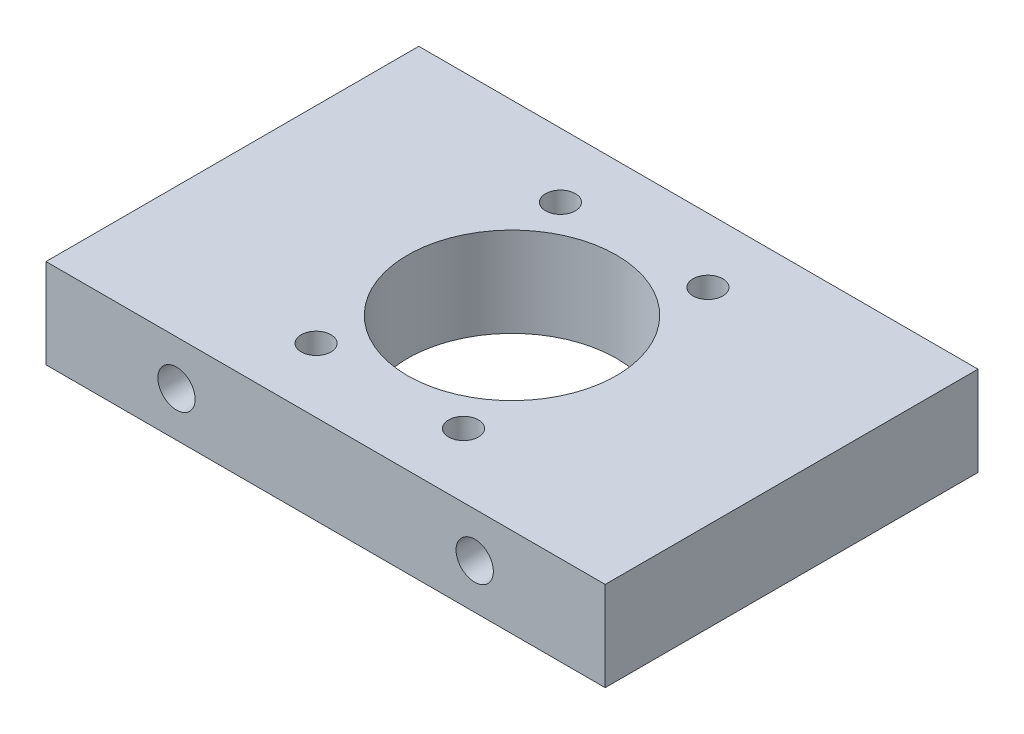
ISO-10303-21;
HEADER;
FILE_DESCRIPTION(('STEP AP214'),'2;1');
FILE_NAME('part.step','',(''),(''),'','','');
FILE_SCHEMA(('AUTOMOTIVE_DESIGN { 1 0 10303 214 1 1 1 1 }'));
ENDSEC;
DATA;
#1=APPLICATION_CONTEXT('core data for automotive mechanical design processes');
#2=APPLICATION_PROTOCOL_DEFINITION('international standard','automotive_design',2000,#1);
#3=PRODUCT_CONTEXT('',#1,'mechanical');
#4=PRODUCT('Part','Part','',(#3));
#5=PRODUCT_RELATED_PRODUCT_CATEGORY('part','',(#4));
#6=PRODUCT_DEFINITION_FORMATION('','',#4);
#7=PRODUCT_DEFINITION_CONTEXT('part definition',#1,'design');
#8=PRODUCT_DEFINITION('design','',#6,#7);
#9=PRODUCT_DEFINITION_SHAPE('','',#8);
#10=(LENGTH_UNIT() NAMED_UNIT(*) SI_UNIT(.MILLI.,.METRE.));
#11=(NAMED_UNIT(*) PLANE_ANGLE_UNIT() SI_UNIT($,.RADIAN.));
#12=(NAMED_UNIT(*) SI_UNIT($,.STERADIAN.) SOLID_ANGLE_UNIT());
#13=UNCERTAINTY_MEASURE_WITH_UNIT(LENGTH_MEASURE(1.E-05),#10,'distance_accuracy_value','');
#14=(GEOMETRIC_REPRESENTATION_CONTEXT(3) GLOBAL_UNCERTAINTY_ASSIGNED_CONTEXT((#13)) GLOBAL_UNIT_ASSIGNED_CONTEXT((#10,
#11,#12)) REPRESENTATION_CONTEXT('',''));
#15=CARTESIAN_POINT('',(0.,0.,0.));
#16=DIRECTION('',(0.,0.,1.));
#17=DIRECTION('',(1.,0.,0.));
#18=AXIS2_PLACEMENT_3D('',#15,#16,#17);
#19=CARTESIAN_POINT('',(37.5,12.,-25.));
#20=DIRECTION('',(0.,0.,1.));
#21=DIRECTION('',(1.,0.,0.));
#22=AXIS2_PLACEMENT_3D('',#19,#20,#21);
#23=PLANE('',#22);
#24=CARTESIAN_POINT('',(-20.0000000000006,6.00000000000134,-25.));
#25=DIRECTION('',(0.,0.,-1.));
#26=DIRECTION('',(-1.,0.,0.));
#27=AXIS2_PLACEMENT_3D('',#24,#25,#26);
#28=CIRCLE('',#27,2.49999999999999);
#29=CARTESIAN_POINT('',(-22.5000000000005,6.00000000000134,-25.));
#30=VERTEX_POINT('',#29);
#31=EDGE_CURVE('E150',#30,#30,#28,.T.);
#32=ORIENTED_EDGE('',*,*,#31,.F.);
#33=EDGE_LOOP('',(#32));
#34=FACE_BOUND('',#33,.T.);
#35=DIRECTION('',(-1.,0.,0.));
#36=VECTOR('',#35,1.);
#37=CARTESIAN_POINT('',(37.5,0.,-25.));
#38=LINE('',#37,#36);
#39=CARTESIAN_POINT('',(37.5,0.,-25.));
#40=VERTEX_POINT('',#39);
#41=CARTESIAN_POINT('',(-37.5,0.,-25.));
#42=VERTEX_POINT('',#41);
#43=EDGE_CURVE('E74',#40,#42,#38,.T.);
#44=ORIENTED_EDGE('',*,*,#43,.T.);
#45=DIRECTION('',(0.,-1.,0.));
#46=VECTOR('',#45,1.);
#47=CARTESIAN_POINT('',(-37.5,12.,-25.));
#48=LINE('',#47,#46);
#49=CARTESIAN_POINT('',(-37.5,12.,-25.));
#50=VERTEX_POINT('',#49);
#51=EDGE_CURVE('E94',#50,#42,#48,.T.);
#52=ORIENTED_EDGE('',*,*,#51,.F.);
#53=DIRECTION('',(-1.,0.,0.));
#54=VECTOR('',#53,1.);
#55=CARTESIAN_POINT('',(37.5,12.,-25.));
#56=LINE('',#55,#54);
#57=CARTESIAN_POINT('',(37.5,12.,-25.));
#58=VERTEX_POINT('',#57);
#59=EDGE_CURVE('E51',#58,#50,#56,.T.);
#60=ORIENTED_EDGE('',*,*,#59,.F.);
#61=DIRECTION('',(0.,-1.,0.));
#62=VECTOR('',#61,1.);
#63=CARTESIAN_POINT('',(37.5,12.,-25.));
#64=LINE('',#63,#62);
#65=EDGE_CURVE('E91',#58,#40,#64,.T.);
#66=ORIENTED_EDGE('',*,*,#65,.T.);
#67=EDGE_LOOP('',(#44,#52,#60,#66));
#68=FACE_BOUND('',#67,.T.);
#69=CARTESIAN_POINT('',(20.0000000000006,6.00000000000134,-25.));
#70=DIRECTION('',(0.,0.,-1.));
#71=DIRECTION('',(-1.,0.,0.));
#72=AXIS2_PLACEMENT_3D('',#69,#70,#71);
#73=CIRCLE('',#72,2.49999999999999);
#74=CARTESIAN_POINT('',(17.5000000000006,6.00000000000134,-25.));
#75=VERTEX_POINT('',#74);
#76=EDGE_CURVE('E144',#75,#75,#73,.T.);
#77=ORIENTED_EDGE('',*,*,#76,.F.);
#78=EDGE_LOOP('',(#77));
#79=FACE_BOUND('',#78,.T.);
#80=ADVANCED_FACE('F34',(#34,#68,#79),#23,.F.);
#81=CARTESIAN_POINT('',(-37.5,12.,25.));
#82=DIRECTION('',(1.,0.,0.));
#83=DIRECTION('',(0.,0.,-1.));
#84=AXIS2_PLACEMENT_3D('',#81,#82,#83);
#85=PLANE('',#84);
#86=DIRECTION('',(0.,0.,1.));
#87=VECTOR('',#86,1.);
#88=CARTESIAN_POINT('',(-37.5,0.,25.));
#89=LINE('',#88,#87);
#90=CARTESIAN_POINT('',(-37.5,0.,25.));
#91=VERTEX_POINT('',#90);
#92=EDGE_CURVE('E98',#42,#91,#89,.T.);
#93=ORIENTED_EDGE('',*,*,#92,.T.);
#94=DIRECTION('',(0.,-1.,0.));
#95=VECTOR('',#94,1.);
#96=CARTESIAN_POINT('',(-37.5,12.,25.));
#97=LINE('',#96,#95);
#98=CARTESIAN_POINT('',(-37.5,12.,25.));
#99=VERTEX_POINT('',#98);
#100=EDGE_CURVE('E11',#99,#91,#97,.T.);
#101=ORIENTED_EDGE('',*,*,#100,.F.);
#102=DIRECTION('',(0.,0.,1.));
#103=VECTOR('',#102,1.);
#104=CARTESIAN_POINT('',(-37.5,12.,25.));
#105=LINE('',#104,#103);
#106=EDGE_CURVE('E86',#50,#99,#105,.T.);
#107=ORIENTED_EDGE('',*,*,#106,.F.);
#108=ORIENTED_EDGE('',*,*,#51,.T.);
#109=EDGE_LOOP('',(#93,#101,#107,#108));
#110=FACE_BOUND('',#109,.T.);
#111=ADVANCED_FACE('F36',(#110),#85,.F.);
#112=CARTESIAN_POINT('',(37.5,12.,25.));
#113=DIRECTION('',(0.,0.,-1.));
#114=DIRECTION('',(-1.,0.,0.));
#115=AXIS2_PLACEMENT_3D('',#112,#113,#114);
#116=PLANE('',#115);
#117=CARTESIAN_POINT('',(-20.0000000000006,6.00000000000134,25.));
#118=DIRECTION('',(0.,0.,-1.));
#119=DIRECTION('',(-1.,0.,0.));
#120=AXIS2_PLACEMENT_3D('',#117,#118,#119);
#121=CIRCLE('',#120,2.49999999999998);
#122=CARTESIAN_POINT('',(-22.5000000000005,6.00000000000134,25.));
#123=VERTEX_POINT('',#122);
#124=EDGE_CURVE('E147',#123,#123,#121,.T.);
#125=ORIENTED_EDGE('',*,*,#124,.T.);
#126=EDGE_LOOP('',(#125));
#127=FACE_BOUND('',#126,.T.);
#128=CARTESIAN_POINT('',(20.0000000000006,6.00000000000134,25.));
#129=DIRECTION('',(0.,0.,-1.));
#130=DIRECTION('',(-1.,0.,0.));
#131=AXIS2_PLACEMENT_3D('',#128,#129,#130);
#132=CIRCLE('',#131,2.49999999999998);
#133=CARTESIAN_POINT('',(17.5000000000006,6.00000000000134,25.));
#134=VERTEX_POINT('',#133);
#135=EDGE_CURVE('E141',#134,#134,#132,.T.);
#136=ORIENTED_EDGE('',*,*,#135,.T.);
#137=EDGE_LOOP('',(#136));
#138=FACE_BOUND('',#137,.T.);
#139=DIRECTION('',(1.,0.,0.));
#140=VECTOR('',#139,1.);
#141=CARTESIAN_POINT('',(37.5,0.,25.));
#142=LINE('',#141,#140);
#143=CARTESIAN_POINT('',(37.5,0.,25.));
#144=VERTEX_POINT('',#143);
#145=EDGE_CURVE('E90',#91,#144,#142,.T.);
#146=ORIENTED_EDGE('',*,*,#145,.T.);
#147=DIRECTION('',(0.,-1.,0.));
#148=VECTOR('',#147,1.);
#149=CARTESIAN_POINT('',(37.5,12.,25.));
#150=LINE('',#149,#148);
#151=CARTESIAN_POINT('',(37.5,12.,25.));
#152=VERTEX_POINT('',#151);
#153=EDGE_CURVE('E43',#152,#144,#150,.T.);
#154=ORIENTED_EDGE('',*,*,#153,.F.);
#155=DIRECTION('',(1.,0.,0.));
#156=VECTOR('',#155,1.);
#157=CARTESIAN_POINT('',(37.5,12.,25.));
#158=LINE('',#157,#156);
#159=EDGE_CURVE('E81',#99,#152,#158,.T.);
#160=ORIENTED_EDGE('',*,*,#159,.F.);
#161=ORIENTED_EDGE('',*,*,#100,.T.);
#162=EDGE_LOOP('',(#146,#154,#160,#161));
#163=FACE_BOUND('',#162,.T.);
#164=ADVANCED_FACE('F89',(#127,#138,#163),#116,.F.);
#165=CARTESIAN_POINT('',(37.5,12.,25.));
#166=DIRECTION('',(-1.,0.,0.));
#167=DIRECTION('',(0.,0.,1.));
#168=AXIS2_PLACEMENT_3D('',#165,#166,#167);
#169=PLANE('',#168);
#170=DIRECTION('',(0.,0.,-1.));
#171=VECTOR('',#170,1.);
#172=CARTESIAN_POINT('',(37.5,0.,25.));
#173=LINE('',#172,#171);
#174=EDGE_CURVE('E68',#144,#40,#173,.T.);
#175=ORIENTED_EDGE('',*,*,#174,.T.);
#176=ORIENTED_EDGE('',*,*,#65,.F.);
#177=DIRECTION('',(0.,0.,-1.));
#178=VECTOR('',#177,1.);
#179=CARTESIAN_POINT('',(37.5,12.,25.));
#180=LINE('',#179,#178);
#181=EDGE_CURVE('E84',#152,#58,#180,.T.);
#182=ORIENTED_EDGE('',*,*,#181,.F.);
#183=ORIENTED_EDGE('',*,*,#153,.T.);
#184=EDGE_LOOP('',(#175,#176,#182,#183));
#185=FACE_BOUND('',#184,.T.);
#186=ADVANCED_FACE('F92',(#185),#169,.F.);
#187=CARTESIAN_POINT('',(0.,12.,0.));
#188=DIRECTION('',(0.,1.,0.));
#189=DIRECTION('',(0.,0.,1.));
#190=AXIS2_PLACEMENT_3D('',#187,#188,#189);
#191=PLANE('',#190);
#192=CARTESIAN_POINT('',(9.88696854870743,12.,-16.3888228623751));
#193=DIRECTION('',(0.,1.,0.));
#194=DIRECTION('',(0.,0.,1.));
#195=AXIS2_PLACEMENT_3D('',#192,#193,#194);
#196=CIRCLE('',#195,2.);
#197=CARTESIAN_POINT('',(9.88696854870743,12.,-14.3888228623751));
#198=VERTEX_POINT('',#197);
#199=EDGE_CURVE('E135',#198,#198,#196,.T.);
#200=ORIENTED_EDGE('',*,*,#199,.F.);
#201=EDGE_LOOP('',(#200));
#202=FACE_BOUND('',#201,.T.);
#203=CARTESIAN_POINT('',(-9.88696854870743,12.,-16.3888228623751));
#204=DIRECTION('',(0.,1.,0.));
#205=DIRECTION('',(0.,0.,1.));
#206=AXIS2_PLACEMENT_3D('',#203,#204,#205);
#207=CIRCLE('',#206,2.);
#208=CARTESIAN_POINT('',(-9.88696854870743,12.,-14.3888228623751));
#209=VERTEX_POINT('',#208);
#210=EDGE_CURVE('E129',#209,#209,#207,.T.);
#211=ORIENTED_EDGE('',*,*,#210,.F.);
#212=EDGE_LOOP('',(#211));
#213=FACE_BOUND('',#212,.T.);
#214=CARTESIAN_POINT('',(9.88696854870743,12.,16.3888228623751));
#215=DIRECTION('',(0.,1.,0.));
#216=DIRECTION('',(0.,0.,1.));
#217=AXIS2_PLACEMENT_3D('',#214,#215,#216);
#218=CIRCLE('',#217,2.);
#219=CARTESIAN_POINT('',(9.88696854870743,12.,18.3888228623751));
#220=VERTEX_POINT('',#219);
#221=EDGE_CURVE('E123',#220,#220,#218,.T.);
#222=ORIENTED_EDGE('',*,*,#221,.F.);
#223=EDGE_LOOP('',(#222));
#224=FACE_BOUND('',#223,.T.);
#225=CARTESIAN_POINT('',(-9.88696854870743,12.,16.3888228623751));
#226=DIRECTION('',(0.,1.,0.));
#227=DIRECTION('',(0.,0.,1.));
#228=AXIS2_PLACEMENT_3D('',#225,#226,#227);
#229=CIRCLE('',#228,2.);
#230=CARTESIAN_POINT('',(-9.88696854870743,12.,18.3888228623751));
#231=VERTEX_POINT('',#230);
#232=EDGE_CURVE('E115',#231,#231,#229,.T.);
#233=ORIENTED_EDGE('',*,*,#232,.F.);
#234=EDGE_LOOP('',(#233));
#235=FACE_BOUND('',#234,.T.);
#236=CARTESIAN_POINT('',(0.,12.,0.));
#237=DIRECTION('',(0.,1.,0.));
#238=DIRECTION('',(0.,0.,1.));
#239=AXIS2_PLACEMENT_3D('',#236,#237,#238);
#240=CIRCLE('',#239,14.01);
#241=CARTESIAN_POINT('',(0.,12.,14.01));
#242=VERTEX_POINT('',#241);
#243=EDGE_CURVE('E112',#242,#242,#240,.T.);
#244=ORIENTED_EDGE('',*,*,#243,.F.);
#245=EDGE_LOOP('',(#244));
#246=FACE_BOUND('',#245,.T.);
#247=ORIENTED_EDGE('',*,*,#106,.T.);
#248=ORIENTED_EDGE('',*,*,#159,.T.);
#249=ORIENTED_EDGE('',*,*,#181,.T.);
#250=ORIENTED_EDGE('',*,*,#59,.T.);
#251=EDGE_LOOP('',(#247,#248,#249,#250));
#252=FACE_BOUND('',#251,.T.);
#253=ADVANCED_FACE('F82',(#202,#213,#224,#235,#246,#252),#191,.T.);
#254=CARTESIAN_POINT('',(0.,0.,0.));
#255=DIRECTION('',(0.,1.,0.));
#256=DIRECTION('',(0.,0.,1.));
#257=AXIS2_PLACEMENT_3D('',#254,#255,#256);
#258=PLANE('',#257);
#259=CARTESIAN_POINT('',(9.88696854870743,0.,-16.3888228623751));
#260=DIRECTION('',(0.,-1.,0.));
#261=DIRECTION('',(0.,0.,-1.));
#262=AXIS2_PLACEMENT_3D('',#259,#260,#261);
#263=CIRCLE('',#262,2.);
#264=CARTESIAN_POINT('',(9.88696854870743,0.,-18.3888228623751));
#265=VERTEX_POINT('',#264);
#266=EDGE_CURVE('E138',#265,#265,#263,.T.);
#267=ORIENTED_EDGE('',*,*,#266,.F.);
#268=EDGE_LOOP('',(#267));
#269=FACE_BOUND('',#268,.T.);
#270=CARTESIAN_POINT('',(-9.88696854870743,0.,-16.3888228623751));
#271=DIRECTION('',(0.,-1.,0.));
#272=DIRECTION('',(0.,0.,1.));
#273=AXIS2_PLACEMENT_3D('',#270,#271,#272);
#274=CIRCLE('',#273,2.);
#275=CARTESIAN_POINT('',(-9.88696854870743,0.,-14.3888228623751));
#276=VERTEX_POINT('',#275);
#277=EDGE_CURVE('E132',#276,#276,#274,.T.);
#278=ORIENTED_EDGE('',*,*,#277,.F.);
#279=EDGE_LOOP('',(#278));
#280=FACE_BOUND('',#279,.T.);
#281=CARTESIAN_POINT('',(9.88696854870743,0.,16.3888228623751));
#282=DIRECTION('',(0.,-1.,0.));
#283=DIRECTION('',(0.,0.,1.));
#284=AXIS2_PLACEMENT_3D('',#281,#282,#283);
#285=CIRCLE('',#284,2.);
#286=CARTESIAN_POINT('',(9.88696854870743,0.,18.3888228623751));
#287=VERTEX_POINT('',#286);
#288=EDGE_CURVE('E126',#287,#287,#285,.T.);
#289=ORIENTED_EDGE('',*,*,#288,.F.);
#290=EDGE_LOOP('',(#289));
#291=FACE_BOUND('',#290,.T.);
#292=CARTESIAN_POINT('',(-9.88696854870743,0.,16.3888228623751));
#293=DIRECTION('',(0.,-1.,0.));
#294=DIRECTION('',(0.,0.,-1.));
#295=AXIS2_PLACEMENT_3D('',#292,#293,#294);
#296=CIRCLE('',#295,2.);
#297=CARTESIAN_POINT('',(-9.88696854870743,0.,14.3888228623751));
#298=VERTEX_POINT('',#297);
#299=EDGE_CURVE('E120',#298,#298,#296,.T.);
#300=ORIENTED_EDGE('',*,*,#299,.F.);
#301=EDGE_LOOP('',(#300));
#302=FACE_BOUND('',#301,.T.);
#303=CARTESIAN_POINT('',(0.,0.,0.));
#304=DIRECTION('',(0.,1.,0.));
#305=DIRECTION('',(0.,0.,1.));
#306=AXIS2_PLACEMENT_3D('',#303,#304,#305);
#307=CIRCLE('',#306,14.01);
#308=CARTESIAN_POINT('',(0.,0.,14.01));
#309=VERTEX_POINT('',#308);
#310=EDGE_CURVE('E101',#309,#309,#307,.T.);
#311=ORIENTED_EDGE('',*,*,#310,.T.);
#312=EDGE_LOOP('',(#311));
#313=FACE_BOUND('',#312,.T.);
#314=ORIENTED_EDGE('',*,*,#92,.F.);
#315=ORIENTED_EDGE('',*,*,#43,.F.);
#316=ORIENTED_EDGE('',*,*,#174,.F.);
#317=ORIENTED_EDGE('',*,*,#145,.F.);
#318=EDGE_LOOP('',(#314,#315,#316,#317));
#319=FACE_BOUND('',#318,.T.);
#320=ADVANCED_FACE('F109',(#269,#280,#291,#302,#313,#319),#258,.F.);
#321=CARTESIAN_POINT('',(0.,0.,0.));
#322=DIRECTION('',(0.,1.,0.));
#323=DIRECTION('',(0.,0.,1.));
#324=AXIS2_PLACEMENT_3D('',#321,#322,#323);
#325=CYLINDRICAL_SURFACE('',#324,14.01);
#326=ORIENTED_EDGE('',*,*,#310,.F.);
#327=EDGE_LOOP('',(#326));
#328=FACE_BOUND('',#327,.T.);
#329=ORIENTED_EDGE('',*,*,#243,.T.);
#330=EDGE_LOOP('',(#329));
#331=FACE_BOUND('',#330,.T.);
#332=ADVANCED_FACE('F199',(#328,#331),#325,.F.);
#333=CARTESIAN_POINT('',(-9.88696854870743,19.,16.3888228623751));
#334=DIRECTION('',(0.,-1.,0.));
#335=DIRECTION('',(0.,0.,-1.));
#336=AXIS2_PLACEMENT_3D('',#333,#334,#335);
#337=CYLINDRICAL_SURFACE('',#336,2.);
#338=ORIENTED_EDGE('',*,*,#232,.T.);
#339=EDGE_LOOP('',(#338));
#340=FACE_BOUND('',#339,.T.);
#341=ORIENTED_EDGE('',*,*,#299,.T.);
#342=EDGE_LOOP('',(#341));
#343=FACE_BOUND('',#342,.T.);
#344=ADVANCED_FACE('F195',(#340,#343),#337,.F.);
#345=CARTESIAN_POINT('',(9.88696854870743,19.,16.3888228623751));
#346=DIRECTION('',(0.,-1.,0.));
#347=DIRECTION('',(0.,0.,-1.));
#348=AXIS2_PLACEMENT_3D('',#345,#346,#347);
#349=CYLINDRICAL_SURFACE('',#348,2.);
#350=ORIENTED_EDGE('',*,*,#221,.T.);
#351=EDGE_LOOP('',(#350));
#352=FACE_BOUND('',#351,.T.);
#353=ORIENTED_EDGE('',*,*,#288,.T.);
#354=EDGE_LOOP('',(#353));
#355=FACE_BOUND('',#354,.T.);
#356=ADVANCED_FACE('F191',(#352,#355),#349,.F.);
#357=CARTESIAN_POINT('',(-9.88696854870743,19.,-16.3888228623751));
#358=DIRECTION('',(0.,-1.,0.));
#359=DIRECTION('',(0.,0.,-1.));
#360=AXIS2_PLACEMENT_3D('',#357,#358,#359);
#361=CYLINDRICAL_SURFACE('',#360,2.);
#362=ORIENTED_EDGE('',*,*,#210,.T.);
#363=EDGE_LOOP('',(#362));
#364=FACE_BOUND('',#363,.T.);
#365=ORIENTED_EDGE('',*,*,#277,.T.);
#366=EDGE_LOOP('',(#365));
#367=FACE_BOUND('',#366,.T.);
#368=ADVANCED_FACE('F185',(#364,#367),#361,.F.);
#369=CARTESIAN_POINT('',(9.88696854870743,19.,-16.3888228623751));
#370=DIRECTION('',(0.,-1.,0.));
#371=DIRECTION('',(0.,0.,-1.));
#372=AXIS2_PLACEMENT_3D('',#369,#370,#371);
#373=CYLINDRICAL_SURFACE('',#372,2.);
#374=ORIENTED_EDGE('',*,*,#199,.T.);
#375=EDGE_LOOP('',(#374));
#376=FACE_BOUND('',#375,.T.);
#377=ORIENTED_EDGE('',*,*,#266,.T.);
#378=EDGE_LOOP('',(#377));
#379=FACE_BOUND('',#378,.T.);
#380=ADVANCED_FACE('F176',(#376,#379),#373,.F.);
#381=CARTESIAN_POINT('',(20.0000000000006,6.00000000000134,-25.));
#382=DIRECTION('',(0.,0.,-1.));
#383=DIRECTION('',(-1.,0.,0.));
#384=AXIS2_PLACEMENT_3D('',#381,#382,#383);
#385=CYLINDRICAL_SURFACE('',#384,2.49999999999998);
#386=ORIENTED_EDGE('',*,*,#135,.F.);
#387=EDGE_LOOP('',(#386));
#388=FACE_BOUND('',#387,.T.);
#389=ORIENTED_EDGE('',*,*,#76,.T.);
#390=EDGE_LOOP('',(#389));
#391=FACE_BOUND('',#390,.T.);
#392=ADVANCED_FACE('F173',(#388,#391),#385,.F.);
#393=CARTESIAN_POINT('',(-20.0000000000006,6.00000000000134,-25.));
#394=DIRECTION('',(0.,0.,-1.));
#395=DIRECTION('',(-1.,0.,0.));
#396=AXIS2_PLACEMENT_3D('',#393,#394,#395);
#397=CYLINDRICAL_SURFACE('',#396,2.49999999999998);
#398=ORIENTED_EDGE('',*,*,#124,.F.);
#399=EDGE_LOOP('',(#398));
#400=FACE_BOUND('',#399,.T.);
#401=ORIENTED_EDGE('',*,*,#31,.T.);
#402=EDGE_LOOP('',(#401));
#403=FACE_BOUND('',#402,.T.);
#404=ADVANCED_FACE('F154',(#400,#403),#397,.F.);
#405=CLOSED_SHELL('',(#80,#111,#164,#186,#253,#320,#332,#344,#356,#368,#380,#392,#404));
#406=MANIFOLD_SOLID_BREP('B2',#405);
#407=ADVANCED_BREP_SHAPE_REPRESENTATION('',(#18,#406),#14);
#408=SHAPE_DEFINITION_REPRESENTATION(#9,#407);
ENDSEC;
END-ISO-10303-21;
